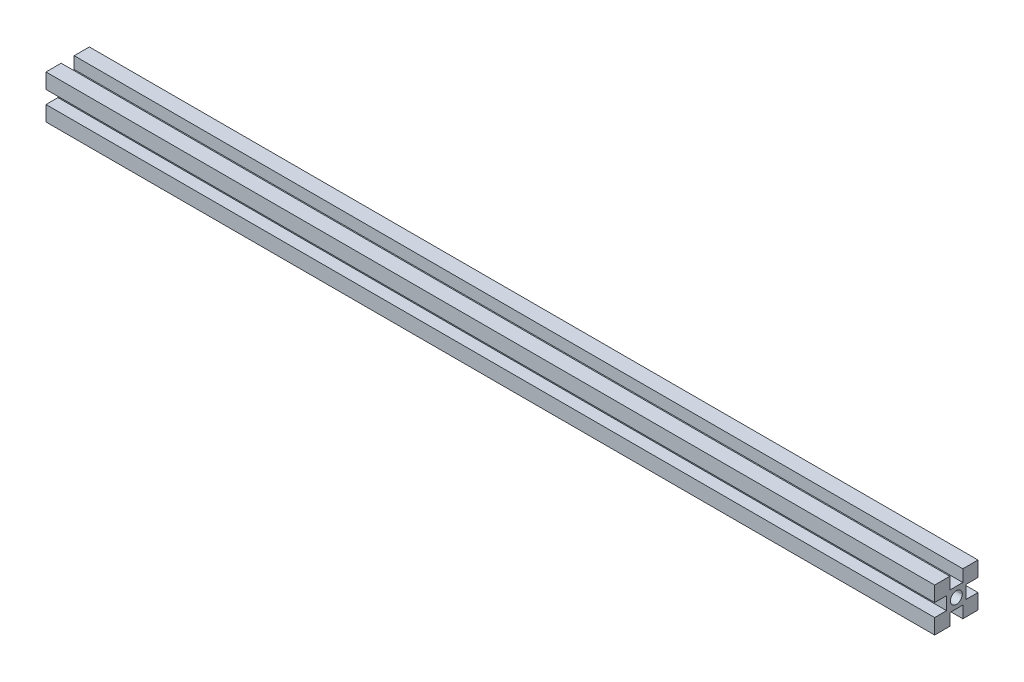
ISO-10303-21;
HEADER;
FILE_DESCRIPTION(('STEP AP214'),'2;1');
FILE_NAME('part.step','',(''),(''),'','','');
FILE_SCHEMA(('AUTOMOTIVE_DESIGN { 1 0 10303 214 1 1 1 1 }'));
ENDSEC;
DATA;
#1=APPLICATION_CONTEXT('core data for automotive mechanical design processes');
#2=APPLICATION_PROTOCOL_DEFINITION('international standard','automotive_design',2000,#1);
#3=PRODUCT_CONTEXT('',#1,'mechanical');
#4=PRODUCT('Part','Part','',(#3));
#5=PRODUCT_RELATED_PRODUCT_CATEGORY('part','',(#4));
#6=PRODUCT_DEFINITION_FORMATION('','',#4);
#7=PRODUCT_DEFINITION_CONTEXT('part definition',#1,'design');
#8=PRODUCT_DEFINITION('design','',#6,#7);
#9=PRODUCT_DEFINITION_SHAPE('','',#8);
#10=(LENGTH_UNIT() NAMED_UNIT(*) SI_UNIT(.MILLI.,.METRE.));
#11=(NAMED_UNIT(*) PLANE_ANGLE_UNIT() SI_UNIT($,.RADIAN.));
#12=(NAMED_UNIT(*) SI_UNIT($,.STERADIAN.) SOLID_ANGLE_UNIT());
#13=UNCERTAINTY_MEASURE_WITH_UNIT(LENGTH_MEASURE(1.E-05),#10,'distance_accuracy_value','');
#14=(GEOMETRIC_REPRESENTATION_CONTEXT(3) GLOBAL_UNCERTAINTY_ASSIGNED_CONTEXT((#13)) GLOBAL_UNIT_ASSIGNED_CONTEXT((#10,
#11,#12)) REPRESENTATION_CONTEXT('',''));
#15=CARTESIAN_POINT('',(0.,0.,0.));
#16=DIRECTION('',(0.,0.,1.));
#17=DIRECTION('',(1.,0.,0.));
#18=AXIS2_PLACEMENT_3D('',#15,#16,#17);
#19=CARTESIAN_POINT('',(207.5,0.,0.));
#20=DIRECTION('',(-1.,0.,0.));
#21=DIRECTION('',(0.,0.,-1.));
#22=AXIS2_PLACEMENT_3D('',#19,#20,#21);
#23=CYLINDRICAL_SURFACE('',#22,2.75);
#24=CARTESIAN_POINT('',(410.,0.,0.));
#25=DIRECTION('',(1.,0.,0.));
#26=DIRECTION('',(0.,0.,-1.));
#27=AXIS2_PLACEMENT_3D('',#24,#25,#26);
#28=CIRCLE('',#27,2.75);
#29=CARTESIAN_POINT('',(410.,0.,2.75));
#30=VERTEX_POINT('',#29);
#31=CARTESIAN_POINT('',(410.,0.,-2.75));
#32=VERTEX_POINT('',#31);
#33=EDGE_CURVE('E57',#30,#32,#28,.F.);
#34=ORIENTED_EDGE('',*,*,#33,.F.);
#35=DIRECTION('',(1.,0.,0.));
#36=VECTOR('',#35,1.);
#37=CARTESIAN_POINT('',(207.5,0.,2.75));
#38=LINE('',#37,#36);
#39=CARTESIAN_POINT('',(0.,0.,2.75));
#40=VERTEX_POINT('',#39);
#41=EDGE_CURVE('E352',#40,#30,#38,.T.);
#42=ORIENTED_EDGE('',*,*,#41,.F.);
#43=CARTESIAN_POINT('',(0.,0.,0.));
#44=DIRECTION('',(1.,0.,0.));
#45=DIRECTION('',(0.,0.,-1.));
#46=AXIS2_PLACEMENT_3D('',#43,#44,#45);
#47=CIRCLE('',#46,2.75);
#48=CARTESIAN_POINT('',(0.,0.,-2.75));
#49=VERTEX_POINT('',#48);
#50=EDGE_CURVE('E256',#49,#40,#47,.T.);
#51=ORIENTED_EDGE('',*,*,#50,.F.);
#52=DIRECTION('',(-1.,0.,0.));
#53=VECTOR('',#52,1.);
#54=CARTESIAN_POINT('',(207.5,0.,-2.75));
#55=LINE('',#54,#53);
#56=EDGE_CURVE('E51',#32,#49,#55,.T.);
#57=ORIENTED_EDGE('',*,*,#56,.F.);
#58=EDGE_LOOP('',(#34,#42,#51,#57));
#59=FACE_BOUND('',#58,.T.);
#60=ADVANCED_FACE('F43',(#59),#23,.F.);
#61=CARTESIAN_POINT('',(207.5,0.,0.));
#62=DIRECTION('',(-1.,0.,0.));
#63=DIRECTION('',(0.,0.,-1.));
#64=AXIS2_PLACEMENT_3D('',#61,#62,#63);
#65=CYLINDRICAL_SURFACE('',#64,2.75);
#66=CARTESIAN_POINT('',(410.,0.,0.));
#67=DIRECTION('',(1.,0.,0.));
#68=DIRECTION('',(0.,0.,-1.));
#69=AXIS2_PLACEMENT_3D('',#66,#67,#68);
#70=CIRCLE('',#69,2.75);
#71=EDGE_CURVE('E428',#32,#30,#70,.F.);
#72=ORIENTED_EDGE('',*,*,#71,.F.);
#73=ORIENTED_EDGE('',*,*,#56,.T.);
#74=CARTESIAN_POINT('',(0.,0.,0.));
#75=DIRECTION('',(1.,0.,0.));
#76=DIRECTION('',(0.,0.,-1.));
#77=AXIS2_PLACEMENT_3D('',#74,#75,#76);
#78=CIRCLE('',#77,2.75);
#79=EDGE_CURVE('E254',#40,#49,#78,.T.);
#80=ORIENTED_EDGE('',*,*,#79,.F.);
#81=ORIENTED_EDGE('',*,*,#41,.T.);
#82=EDGE_LOOP('',(#72,#73,#80,#81));
#83=FACE_BOUND('',#82,.T.);
#84=ADVANCED_FACE('F640',(#83),#65,.F.);
#85=CARTESIAN_POINT('',(0.,3.,-4.5));
#86=DIRECTION('',(0.,0.,-1.));
#87=DIRECTION('',(0.,-1.,0.));
#88=AXIS2_PLACEMENT_3D('',#85,#86,#87);
#89=PLANE('',#88);
#90=DIRECTION('',(1.,0.,0.));
#91=VECTOR('',#90,1.);
#92=CARTESIAN_POINT('',(0.,3.,-4.5));
#93=LINE('',#92,#91);
#94=CARTESIAN_POINT('',(0.,3.,-4.5));
#95=VERTEX_POINT('',#94);
#96=CARTESIAN_POINT('',(410.,3.,-4.5));
#97=VERTEX_POINT('',#96);
#98=EDGE_CURVE('E348',#95,#97,#93,.T.);
#99=ORIENTED_EDGE('',*,*,#98,.T.);
#100=DIRECTION('',(0.,-1.,0.));
#101=VECTOR('',#100,1.);
#102=CARTESIAN_POINT('',(410.,3.,-4.5));
#103=LINE('',#102,#101);
#104=CARTESIAN_POINT('',(410.,-3.,-4.5));
#105=VERTEX_POINT('',#104);
#106=EDGE_CURVE('E65',#97,#105,#103,.T.);
#107=ORIENTED_EDGE('',*,*,#106,.T.);
#108=DIRECTION('',(1.,0.,0.));
#109=VECTOR('',#108,1.);
#110=CARTESIAN_POINT('',(0.,-3.,-4.5));
#111=LINE('',#110,#109);
#112=CARTESIAN_POINT('',(0.,-3.,-4.5));
#113=VERTEX_POINT('',#112);
#114=EDGE_CURVE('E320',#113,#105,#111,.T.);
#115=ORIENTED_EDGE('',*,*,#114,.F.);
#116=DIRECTION('',(0.,-1.,0.));
#117=VECTOR('',#116,1.);
#118=CARTESIAN_POINT('',(0.,3.,-4.5));
#119=LINE('',#118,#117);
#120=EDGE_CURVE('E331',#95,#113,#119,.T.);
#121=ORIENTED_EDGE('',*,*,#120,.F.);
#122=EDGE_LOOP('',(#99,#107,#115,#121));
#123=FACE_BOUND('',#122,.T.);
#124=ADVANCED_FACE('F635',(#123),#89,.T.);
#125=CARTESIAN_POINT('',(0.,-3.,-4.5));
#126=DIRECTION('',(0.,1.,0.));
#127=DIRECTION('',(1.,0.,0.));
#128=AXIS2_PLACEMENT_3D('',#125,#126,#127);
#129=PLANE('',#128);
#130=ORIENTED_EDGE('',*,*,#114,.T.);
#131=DIRECTION('',(0.,0.,-1.));
#132=VECTOR('',#131,1.);
#133=CARTESIAN_POINT('',(410.,-3.,-4.5));
#134=LINE('',#133,#132);
#135=CARTESIAN_POINT('',(410.,-3.,-10.));
#136=VERTEX_POINT('',#135);
#137=EDGE_CURVE('E904',#105,#136,#134,.T.);
#138=ORIENTED_EDGE('',*,*,#137,.T.);
#139=DIRECTION('',(1.,0.,0.));
#140=VECTOR('',#139,1.);
#141=CARTESIAN_POINT('',(0.,-3.,-10.));
#142=LINE('',#141,#140);
#143=CARTESIAN_POINT('',(0.,-3.,-10.));
#144=VERTEX_POINT('',#143);
#145=EDGE_CURVE('E317',#144,#136,#142,.T.);
#146=ORIENTED_EDGE('',*,*,#145,.F.);
#147=DIRECTION('',(0.,0.,-1.));
#148=VECTOR('',#147,1.);
#149=CARTESIAN_POINT('',(0.,-3.,-4.5));
#150=LINE('',#149,#148);
#151=EDGE_CURVE('E330',#113,#144,#150,.T.);
#152=ORIENTED_EDGE('',*,*,#151,.F.);
#153=EDGE_LOOP('',(#130,#138,#146,#152));
#154=FACE_BOUND('',#153,.T.);
#155=ADVANCED_FACE('F827',(#154),#129,.T.);
#156=CARTESIAN_POINT('',(0.,-3.,-10.));
#157=DIRECTION('',(0.,0.,-1.));
#158=DIRECTION('',(0.,-1.,0.));
#159=AXIS2_PLACEMENT_3D('',#156,#157,#158);
#160=PLANE('',#159);
#161=ORIENTED_EDGE('',*,*,#145,.T.);
#162=DIRECTION('',(0.,1.,0.));
#163=VECTOR('',#162,1.);
#164=CARTESIAN_POINT('',(410.,10.,-10.));
#165=LINE('',#164,#163);
#166=CARTESIAN_POINT('',(410.,-10.,-10.));
#167=VERTEX_POINT('',#166);
#168=EDGE_CURVE('E897',#167,#136,#165,.T.);
#169=ORIENTED_EDGE('',*,*,#168,.F.);
#170=DIRECTION('',(1.,0.,0.));
#171=VECTOR('',#170,1.);
#172=CARTESIAN_POINT('',(0.,-10.,-10.));
#173=LINE('',#172,#171);
#174=CARTESIAN_POINT('',(0.,-10.,-10.));
#175=VERTEX_POINT('',#174);
#176=EDGE_CURVE('E321',#175,#167,#173,.T.);
#177=ORIENTED_EDGE('',*,*,#176,.F.);
#178=DIRECTION('',(0.,-1.,0.));
#179=VECTOR('',#178,1.);
#180=CARTESIAN_POINT('',(0.,-3.,-10.));
#181=LINE('',#180,#179);
#182=EDGE_CURVE('E327',#144,#175,#181,.T.);
#183=ORIENTED_EDGE('',*,*,#182,.F.);
#184=EDGE_LOOP('',(#161,#169,#177,#183));
#185=FACE_BOUND('',#184,.T.);
#186=ADVANCED_FACE('F818',(#185),#160,.T.);
#187=CARTESIAN_POINT('',(0.,-10.,-10.));
#188=DIRECTION('',(0.,-1.,0.));
#189=DIRECTION('',(0.,0.,-1.));
#190=AXIS2_PLACEMENT_3D('',#187,#188,#189);
#191=PLANE('',#190);
#192=ORIENTED_EDGE('',*,*,#176,.T.);
#193=DIRECTION('',(0.,0.,-1.));
#194=VECTOR('',#193,1.);
#195=CARTESIAN_POINT('',(410.,-10.,10.));
#196=LINE('',#195,#194);
#197=CARTESIAN_POINT('',(410.,-10.,-3.));
#198=VERTEX_POINT('',#197);
#199=EDGE_CURVE('E234',#198,#167,#196,.T.);
#200=ORIENTED_EDGE('',*,*,#199,.F.);
#201=DIRECTION('',(1.,0.,0.));
#202=VECTOR('',#201,1.);
#203=CARTESIAN_POINT('',(0.,-10.,-3.));
#204=LINE('',#203,#202);
#205=CARTESIAN_POINT('',(0.,-10.,-3.));
#206=VERTEX_POINT('',#205);
#207=EDGE_CURVE('E326',#206,#198,#204,.T.);
#208=ORIENTED_EDGE('',*,*,#207,.F.);
#209=DIRECTION('',(0.,0.,1.));
#210=VECTOR('',#209,1.);
#211=CARTESIAN_POINT('',(0.,-10.,-10.));
#212=LINE('',#211,#210);
#213=EDGE_CURVE('E268',#175,#206,#212,.T.);
#214=ORIENTED_EDGE('',*,*,#213,.F.);
#215=EDGE_LOOP('',(#192,#200,#208,#214));
#216=FACE_BOUND('',#215,.T.);
#217=ADVANCED_FACE('F452',(#216),#191,.T.);
#218=CARTESIAN_POINT('',(0.,-10.,-3.));
#219=DIRECTION('',(0.,0.,1.));
#220=DIRECTION('',(1.,0.,0.));
#221=AXIS2_PLACEMENT_3D('',#218,#219,#220);
#222=PLANE('',#221);
#223=ORIENTED_EDGE('',*,*,#207,.T.);
#224=DIRECTION('',(0.,1.,0.));
#225=VECTOR('',#224,1.);
#226=CARTESIAN_POINT('',(410.,-10.,-3.));
#227=LINE('',#226,#225);
#228=CARTESIAN_POINT('',(410.,-4.5,-3.));
#229=VERTEX_POINT('',#228);
#230=EDGE_CURVE('E425',#198,#229,#227,.T.);
#231=ORIENTED_EDGE('',*,*,#230,.T.);
#232=DIRECTION('',(1.,0.,0.));
#233=VECTOR('',#232,1.);
#234=CARTESIAN_POINT('',(0.,-4.5,-3.));
#235=LINE('',#234,#233);
#236=CARTESIAN_POINT('',(0.,-4.5,-3.));
#237=VERTEX_POINT('',#236);
#238=EDGE_CURVE('E322',#237,#229,#235,.T.);
#239=ORIENTED_EDGE('',*,*,#238,.F.);
#240=DIRECTION('',(0.,1.,0.));
#241=VECTOR('',#240,1.);
#242=CARTESIAN_POINT('',(0.,-10.,-3.));
#243=LINE('',#242,#241);
#244=EDGE_CURVE('E259',#206,#237,#243,.T.);
#245=ORIENTED_EDGE('',*,*,#244,.F.);
#246=EDGE_LOOP('',(#223,#231,#239,#245));
#247=FACE_BOUND('',#246,.T.);
#248=ADVANCED_FACE('F454',(#247),#222,.T.);
#249=CARTESIAN_POINT('',(0.,-4.5,-3.));
#250=DIRECTION('',(0.,-1.,0.));
#251=DIRECTION('',(0.,0.,-1.));
#252=AXIS2_PLACEMENT_3D('',#249,#250,#251);
#253=PLANE('',#252);
#254=ORIENTED_EDGE('',*,*,#238,.T.);
#255=DIRECTION('',(0.,0.,1.));
#256=VECTOR('',#255,1.);
#257=CARTESIAN_POINT('',(410.,-4.5,-3.));
#258=LINE('',#257,#256);
#259=CARTESIAN_POINT('',(410.,-4.5,3.));
#260=VERTEX_POINT('',#259);
#261=EDGE_CURVE('E417',#229,#260,#258,.T.);
#262=ORIENTED_EDGE('',*,*,#261,.T.);
#263=DIRECTION('',(1.,0.,0.));
#264=VECTOR('',#263,1.);
#265=CARTESIAN_POINT('',(0.,-4.5,3.));
#266=LINE('',#265,#264);
#267=CARTESIAN_POINT('',(0.,-4.5,3.));
#268=VERTEX_POINT('',#267);
#269=EDGE_CURVE('E246',#268,#260,#266,.T.);
#270=ORIENTED_EDGE('',*,*,#269,.F.);
#271=DIRECTION('',(0.,0.,1.));
#272=VECTOR('',#271,1.);
#273=CARTESIAN_POINT('',(0.,-4.5,-3.));
#274=LINE('',#273,#272);
#275=EDGE_CURVE('E257',#237,#268,#274,.T.);
#276=ORIENTED_EDGE('',*,*,#275,.F.);
#277=EDGE_LOOP('',(#254,#262,#270,#276));
#278=FACE_BOUND('',#277,.T.);
#279=ADVANCED_FACE('F456',(#278),#253,.T.);
#280=CARTESIAN_POINT('',(0.,-4.5,3.));
#281=DIRECTION('',(0.,0.,-1.));
#282=DIRECTION('',(0.,-1.,0.));
#283=AXIS2_PLACEMENT_3D('',#280,#281,#282);
#284=PLANE('',#283);
#285=ORIENTED_EDGE('',*,*,#269,.T.);
#286=DIRECTION('',(0.,-1.,0.));
#287=VECTOR('',#286,1.);
#288=CARTESIAN_POINT('',(410.,-4.5,3.));
#289=LINE('',#288,#287);
#290=CARTESIAN_POINT('',(410.,-10.,3.));
#291=VERTEX_POINT('',#290);
#292=EDGE_CURVE('E415',#260,#291,#289,.T.);
#293=ORIENTED_EDGE('',*,*,#292,.T.);
#294=DIRECTION('',(1.,0.,0.));
#295=VECTOR('',#294,1.);
#296=CARTESIAN_POINT('',(0.,-10.,3.));
#297=LINE('',#296,#295);
#298=CARTESIAN_POINT('',(0.,-10.,3.));
#299=VERTEX_POINT('',#298);
#300=EDGE_CURVE('E232',#299,#291,#297,.T.);
#301=ORIENTED_EDGE('',*,*,#300,.F.);
#302=DIRECTION('',(0.,-1.,0.));
#303=VECTOR('',#302,1.);
#304=CARTESIAN_POINT('',(0.,-4.5,3.));
#305=LINE('',#304,#303);
#306=EDGE_CURVE('E260',#268,#299,#305,.T.);
#307=ORIENTED_EDGE('',*,*,#306,.F.);
#308=EDGE_LOOP('',(#285,#293,#301,#307));
#309=FACE_BOUND('',#308,.T.);
#310=ADVANCED_FACE('F458',(#309),#284,.T.);
#311=CARTESIAN_POINT('',(0.,-10.,3.));
#312=DIRECTION('',(0.,-1.,0.));
#313=DIRECTION('',(0.,0.,-1.));
#314=AXIS2_PLACEMENT_3D('',#311,#312,#313);
#315=PLANE('',#314);
#316=ORIENTED_EDGE('',*,*,#300,.T.);
#317=CARTESIAN_POINT('',(410.,-10.,10.));
#318=VERTEX_POINT('',#317);
#319=EDGE_CURVE('E214',#318,#291,#196,.T.);
#320=ORIENTED_EDGE('',*,*,#319,.F.);
#321=DIRECTION('',(1.,0.,0.));
#322=VECTOR('',#321,1.);
#323=CARTESIAN_POINT('',(0.,-10.,10.));
#324=LINE('',#323,#322);
#325=CARTESIAN_POINT('',(0.,-10.,10.));
#326=VERTEX_POINT('',#325);
#327=EDGE_CURVE('E229',#326,#318,#324,.T.);
#328=ORIENTED_EDGE('',*,*,#327,.F.);
#329=DIRECTION('',(0.,0.,1.));
#330=VECTOR('',#329,1.);
#331=CARTESIAN_POINT('',(0.,-10.,3.));
#332=LINE('',#331,#330);
#333=EDGE_CURVE('E271',#299,#326,#332,.T.);
#334=ORIENTED_EDGE('',*,*,#333,.F.);
#335=EDGE_LOOP('',(#316,#320,#328,#334));
#336=FACE_BOUND('',#335,.T.);
#337=ADVANCED_FACE('F227',(#336),#315,.T.);
#338=CARTESIAN_POINT('',(0.,-10.,10.));
#339=DIRECTION('',(0.,0.,1.));
#340=DIRECTION('',(1.,0.,0.));
#341=AXIS2_PLACEMENT_3D('',#338,#339,#340);
#342=PLANE('',#341);
#343=ORIENTED_EDGE('',*,*,#327,.T.);
#344=DIRECTION('',(0.,-1.,0.));
#345=VECTOR('',#344,1.);
#346=CARTESIAN_POINT('',(410.,10.,10.));
#347=LINE('',#346,#345);
#348=CARTESIAN_POINT('',(410.,-3.,10.));
#349=VERTEX_POINT('',#348);
#350=EDGE_CURVE('E211',#349,#318,#347,.T.);
#351=ORIENTED_EDGE('',*,*,#350,.F.);
#352=DIRECTION('',(1.,0.,0.));
#353=VECTOR('',#352,1.);
#354=CARTESIAN_POINT('',(0.,-3.,10.));
#355=LINE('',#354,#353);
#356=CARTESIAN_POINT('',(0.,-3.,10.));
#357=VERTEX_POINT('',#356);
#358=EDGE_CURVE('E239',#357,#349,#355,.T.);
#359=ORIENTED_EDGE('',*,*,#358,.F.);
#360=DIRECTION('',(0.,1.,0.));
#361=VECTOR('',#360,1.);
#362=CARTESIAN_POINT('',(0.,-10.,10.));
#363=LINE('',#362,#361);
#364=EDGE_CURVE('E237',#326,#357,#363,.T.);
#365=ORIENTED_EDGE('',*,*,#364,.F.);
#366=EDGE_LOOP('',(#343,#351,#359,#365));
#367=FACE_BOUND('',#366,.T.);
#368=ADVANCED_FACE('F236',(#367),#342,.T.);
#369=CARTESIAN_POINT('',(0.,-3.,10.));
#370=DIRECTION('',(0.,1.,0.));
#371=DIRECTION('',(1.,0.,0.));
#372=AXIS2_PLACEMENT_3D('',#369,#370,#371);
#373=PLANE('',#372);
#374=ORIENTED_EDGE('',*,*,#358,.T.);
#375=DIRECTION('',(0.,0.,-1.));
#376=VECTOR('',#375,1.);
#377=CARTESIAN_POINT('',(410.,-3.,10.));
#378=LINE('',#377,#376);
#379=CARTESIAN_POINT('',(410.,-3.,4.5));
#380=VERTEX_POINT('',#379);
#381=EDGE_CURVE('E217',#349,#380,#378,.T.);
#382=ORIENTED_EDGE('',*,*,#381,.T.);
#383=DIRECTION('',(1.,0.,0.));
#384=VECTOR('',#383,1.);
#385=CARTESIAN_POINT('',(0.,-3.,4.5));
#386=LINE('',#385,#384);
#387=CARTESIAN_POINT('',(0.,-3.,4.5));
#388=VERTEX_POINT('',#387);
#389=EDGE_CURVE('E249',#388,#380,#386,.T.);
#390=ORIENTED_EDGE('',*,*,#389,.F.);
#391=DIRECTION('',(0.,0.,-1.));
#392=VECTOR('',#391,1.);
#393=CARTESIAN_POINT('',(0.,-3.,10.));
#394=LINE('',#393,#392);
#395=EDGE_CURVE('E347',#357,#388,#394,.T.);
#396=ORIENTED_EDGE('',*,*,#395,.F.);
#397=EDGE_LOOP('',(#374,#382,#390,#396));
#398=FACE_BOUND('',#397,.T.);
#399=ADVANCED_FACE('F414',(#398),#373,.T.);
#400=CARTESIAN_POINT('',(0.,-3.,4.5));
#401=DIRECTION('',(0.,0.,1.));
#402=DIRECTION('',(1.,0.,0.));
#403=AXIS2_PLACEMENT_3D('',#400,#401,#402);
#404=PLANE('',#403);
#405=ORIENTED_EDGE('',*,*,#389,.T.);
#406=DIRECTION('',(0.,1.,0.));
#407=VECTOR('',#406,1.);
#408=CARTESIAN_POINT('',(410.,-3.,4.5));
#409=LINE('',#408,#407);
#410=CARTESIAN_POINT('',(410.,3.,4.5));
#411=VERTEX_POINT('',#410);
#412=EDGE_CURVE('E411',#380,#411,#409,.T.);
#413=ORIENTED_EDGE('',*,*,#412,.T.);
#414=DIRECTION('',(1.,0.,0.));
#415=VECTOR('',#414,1.);
#416=CARTESIAN_POINT('',(0.,3.,4.5));
#417=LINE('',#416,#415);
#418=CARTESIAN_POINT('',(0.,3.,4.5));
#419=VERTEX_POINT('',#418);
#420=EDGE_CURVE('E303',#419,#411,#417,.T.);
#421=ORIENTED_EDGE('',*,*,#420,.F.);
#422=DIRECTION('',(0.,1.,0.));
#423=VECTOR('',#422,1.);
#424=CARTESIAN_POINT('',(0.,-3.,4.5));
#425=LINE('',#424,#423);
#426=EDGE_CURVE('E361',#388,#419,#425,.T.);
#427=ORIENTED_EDGE('',*,*,#426,.F.);
#428=EDGE_LOOP('',(#405,#413,#421,#427));
#429=FACE_BOUND('',#428,.T.);
#430=ADVANCED_FACE('F409',(#429),#404,.T.);
#431=CARTESIAN_POINT('',(0.,3.,4.5));
#432=DIRECTION('',(0.,-1.,0.));
#433=DIRECTION('',(0.,0.,-1.));
#434=AXIS2_PLACEMENT_3D('',#431,#432,#433);
#435=PLANE('',#434);
#436=ORIENTED_EDGE('',*,*,#420,.T.);
#437=DIRECTION('',(0.,0.,1.));
#438=VECTOR('',#437,1.);
#439=CARTESIAN_POINT('',(410.,3.,4.5));
#440=LINE('',#439,#438);
#441=CARTESIAN_POINT('',(410.,3.,10.));
#442=VERTEX_POINT('',#441);
#443=EDGE_CURVE('E419',#411,#442,#440,.T.);
#444=ORIENTED_EDGE('',*,*,#443,.T.);
#445=DIRECTION('',(1.,0.,0.));
#446=VECTOR('',#445,1.);
#447=CARTESIAN_POINT('',(0.,3.,10.));
#448=LINE('',#447,#446);
#449=CARTESIAN_POINT('',(0.,3.,10.));
#450=VERTEX_POINT('',#449);
#451=EDGE_CURVE('E294',#450,#442,#448,.T.);
#452=ORIENTED_EDGE('',*,*,#451,.F.);
#453=DIRECTION('',(0.,0.,1.));
#454=VECTOR('',#453,1.);
#455=CARTESIAN_POINT('',(0.,3.,4.5));
#456=LINE('',#455,#454);
#457=EDGE_CURVE('E364',#419,#450,#456,.T.);
#458=ORIENTED_EDGE('',*,*,#457,.F.);
#459=EDGE_LOOP('',(#436,#444,#452,#458));
#460=FACE_BOUND('',#459,.T.);
#461=ADVANCED_FACE('F462',(#460),#435,.T.);
#462=CARTESIAN_POINT('',(0.,3.,10.));
#463=DIRECTION('',(0.,0.,1.));
#464=DIRECTION('',(1.,0.,0.));
#465=AXIS2_PLACEMENT_3D('',#462,#463,#464);
#466=PLANE('',#465);
#467=ORIENTED_EDGE('',*,*,#451,.T.);
#468=CARTESIAN_POINT('',(410.,10.,10.));
#469=VERTEX_POINT('',#468);
#470=EDGE_CURVE('E222',#469,#442,#347,.T.);
#471=ORIENTED_EDGE('',*,*,#470,.F.);
#472=DIRECTION('',(1.,0.,0.));
#473=VECTOR('',#472,1.);
#474=CARTESIAN_POINT('',(0.,10.,10.));
#475=LINE('',#474,#473);
#476=CARTESIAN_POINT('',(0.,10.,10.));
#477=VERTEX_POINT('',#476);
#478=EDGE_CURVE('E287',#477,#469,#475,.T.);
#479=ORIENTED_EDGE('',*,*,#478,.F.);
#480=DIRECTION('',(0.,1.,0.));
#481=VECTOR('',#480,1.);
#482=CARTESIAN_POINT('',(0.,3.,10.));
#483=LINE('',#482,#481);
#484=EDGE_CURVE('E382',#450,#477,#483,.T.);
#485=ORIENTED_EDGE('',*,*,#484,.F.);
#486=EDGE_LOOP('',(#467,#471,#479,#485));
#487=FACE_BOUND('',#486,.T.);
#488=ADVANCED_FACE('F463',(#487),#466,.T.);
#489=CARTESIAN_POINT('',(0.,10.,10.));
#490=DIRECTION('',(0.,1.,0.));
#491=DIRECTION('',(1.,0.,0.));
#492=AXIS2_PLACEMENT_3D('',#489,#490,#491);
#493=PLANE('',#492);
#494=ORIENTED_EDGE('',*,*,#478,.T.);
#495=DIRECTION('',(0.,0.,1.));
#496=VECTOR('',#495,1.);
#497=CARTESIAN_POINT('',(410.,10.,10.));
#498=LINE('',#497,#496);
#499=CARTESIAN_POINT('',(410.,10.,3.));
#500=VERTEX_POINT('',#499);
#501=EDGE_CURVE('E899',#500,#469,#498,.T.);
#502=ORIENTED_EDGE('',*,*,#501,.F.);
#503=DIRECTION('',(1.,0.,0.));
#504=VECTOR('',#503,1.);
#505=CARTESIAN_POINT('',(0.,10.,3.));
#506=LINE('',#505,#504);
#507=CARTESIAN_POINT('',(0.,10.,3.));
#508=VERTEX_POINT('',#507);
#509=EDGE_CURVE('E284',#508,#500,#506,.T.);
#510=ORIENTED_EDGE('',*,*,#509,.F.);
#511=DIRECTION('',(0.,0.,-1.));
#512=VECTOR('',#511,1.);
#513=CARTESIAN_POINT('',(0.,10.,10.));
#514=LINE('',#513,#512);
#515=EDGE_CURVE('E366',#477,#508,#514,.T.);
#516=ORIENTED_EDGE('',*,*,#515,.F.);
#517=EDGE_LOOP('',(#494,#502,#510,#516));
#518=FACE_BOUND('',#517,.T.);
#519=ADVANCED_FACE('F728',(#518),#493,.T.);
#520=CARTESIAN_POINT('',(0.,10.,3.));
#521=DIRECTION('',(0.,0.,-1.));
#522=DIRECTION('',(0.,-1.,0.));
#523=AXIS2_PLACEMENT_3D('',#520,#521,#522);
#524=PLANE('',#523);
#525=ORIENTED_EDGE('',*,*,#509,.T.);
#526=DIRECTION('',(0.,-1.,0.));
#527=VECTOR('',#526,1.);
#528=CARTESIAN_POINT('',(410.,10.,3.));
#529=LINE('',#528,#527);
#530=CARTESIAN_POINT('',(410.,4.5,3.));
#531=VERTEX_POINT('',#530);
#532=EDGE_CURVE('E913',#500,#531,#529,.T.);
#533=ORIENTED_EDGE('',*,*,#532,.T.);
#534=DIRECTION('',(1.,0.,0.));
#535=VECTOR('',#534,1.);
#536=CARTESIAN_POINT('',(0.,4.5,3.));
#537=LINE('',#536,#535);
#538=CARTESIAN_POINT('',(0.,4.5,3.));
#539=VERTEX_POINT('',#538);
#540=EDGE_CURVE('E288',#539,#531,#537,.T.);
#541=ORIENTED_EDGE('',*,*,#540,.F.);
#542=DIRECTION('',(0.,-1.,0.));
#543=VECTOR('',#542,1.);
#544=CARTESIAN_POINT('',(0.,10.,3.));
#545=LINE('',#544,#543);
#546=EDGE_CURVE('E291',#508,#539,#545,.T.);
#547=ORIENTED_EDGE('',*,*,#546,.F.);
#548=EDGE_LOOP('',(#525,#533,#541,#547));
#549=FACE_BOUND('',#548,.T.);
#550=ADVANCED_FACE('F718',(#549),#524,.T.);
#551=CARTESIAN_POINT('',(0.,4.5,3.));
#552=DIRECTION('',(0.,1.,0.));
#553=DIRECTION('',(1.,0.,0.));
#554=AXIS2_PLACEMENT_3D('',#551,#552,#553);
#555=PLANE('',#554);
#556=ORIENTED_EDGE('',*,*,#540,.T.);
#557=DIRECTION('',(0.,0.,-1.));
#558=VECTOR('',#557,1.);
#559=CARTESIAN_POINT('',(410.,4.5,3.));
#560=LINE('',#559,#558);
#561=CARTESIAN_POINT('',(410.,4.5,-3.));
#562=VERTEX_POINT('',#561);
#563=EDGE_CURVE('E910',#531,#562,#560,.T.);
#564=ORIENTED_EDGE('',*,*,#563,.T.);
#565=DIRECTION('',(1.,0.,0.));
#566=VECTOR('',#565,1.);
#567=CARTESIAN_POINT('',(0.,4.5,-3.));
#568=LINE('',#567,#566);
#569=CARTESIAN_POINT('',(0.,4.5,-3.));
#570=VERTEX_POINT('',#569);
#571=EDGE_CURVE('E344',#570,#562,#568,.T.);
#572=ORIENTED_EDGE('',*,*,#571,.F.);
#573=DIRECTION('',(0.,0.,-1.));
#574=VECTOR('',#573,1.);
#575=CARTESIAN_POINT('',(0.,4.5,3.));
#576=LINE('',#575,#574);
#577=EDGE_CURVE('E289',#539,#570,#576,.T.);
#578=ORIENTED_EDGE('',*,*,#577,.F.);
#579=EDGE_LOOP('',(#556,#564,#572,#578));
#580=FACE_BOUND('',#579,.T.);
#581=ADVANCED_FACE('F708',(#580),#555,.T.);
#582=CARTESIAN_POINT('',(0.,4.5,-3.));
#583=DIRECTION('',(0.,0.,1.));
#584=DIRECTION('',(1.,0.,0.));
#585=AXIS2_PLACEMENT_3D('',#582,#583,#584);
#586=PLANE('',#585);
#587=ORIENTED_EDGE('',*,*,#571,.T.);
#588=DIRECTION('',(0.,1.,0.));
#589=VECTOR('',#588,1.);
#590=CARTESIAN_POINT('',(410.,4.5,-3.));
#591=LINE('',#590,#589);
#592=CARTESIAN_POINT('',(410.,10.,-3.));
#593=VERTEX_POINT('',#592);
#594=EDGE_CURVE('E907',#562,#593,#591,.T.);
#595=ORIENTED_EDGE('',*,*,#594,.T.);
#596=DIRECTION('',(1.,0.,0.));
#597=VECTOR('',#596,1.);
#598=CARTESIAN_POINT('',(0.,10.,-3.));
#599=LINE('',#598,#597);
#600=CARTESIAN_POINT('',(0.,10.,-3.));
#601=VERTEX_POINT('',#600);
#602=EDGE_CURVE('E353',#601,#593,#599,.T.);
#603=ORIENTED_EDGE('',*,*,#602,.F.);
#604=DIRECTION('',(0.,1.,0.));
#605=VECTOR('',#604,1.);
#606=CARTESIAN_POINT('',(0.,4.5,-3.));
#607=LINE('',#606,#605);
#608=EDGE_CURVE('E292',#570,#601,#607,.T.);
#609=ORIENTED_EDGE('',*,*,#608,.F.);
#610=EDGE_LOOP('',(#587,#595,#603,#609));
#611=FACE_BOUND('',#610,.T.);
#612=ADVANCED_FACE('F698',(#611),#586,.T.);
#613=CARTESIAN_POINT('',(0.,10.,-3.));
#614=DIRECTION('',(0.,1.,0.));
#615=DIRECTION('',(1.,0.,0.));
#616=AXIS2_PLACEMENT_3D('',#613,#614,#615);
#617=PLANE('',#616);
#618=ORIENTED_EDGE('',*,*,#602,.T.);
#619=CARTESIAN_POINT('',(410.,10.,-10.));
#620=VERTEX_POINT('',#619);
#621=EDGE_CURVE('E901',#620,#593,#498,.T.);
#622=ORIENTED_EDGE('',*,*,#621,.F.);
#623=DIRECTION('',(1.,0.,0.));
#624=VECTOR('',#623,1.);
#625=CARTESIAN_POINT('',(0.,10.,-10.));
#626=LINE('',#625,#624);
#627=CARTESIAN_POINT('',(0.,10.,-10.));
#628=VERTEX_POINT('',#627);
#629=EDGE_CURVE('E357',#628,#620,#626,.T.);
#630=ORIENTED_EDGE('',*,*,#629,.F.);
#631=DIRECTION('',(0.,0.,-1.));
#632=VECTOR('',#631,1.);
#633=CARTESIAN_POINT('',(0.,10.,-3.));
#634=LINE('',#633,#632);
#635=EDGE_CURVE('E340',#601,#628,#634,.T.);
#636=ORIENTED_EDGE('',*,*,#635,.F.);
#637=EDGE_LOOP('',(#618,#622,#630,#636));
#638=FACE_BOUND('',#637,.T.);
#639=ADVANCED_FACE('F689',(#638),#617,.T.);
#640=CARTESIAN_POINT('',(0.,10.,-10.));
#641=DIRECTION('',(0.,0.,-1.));
#642=DIRECTION('',(0.,-1.,0.));
#643=AXIS2_PLACEMENT_3D('',#640,#641,#642);
#644=PLANE('',#643);
#645=ORIENTED_EDGE('',*,*,#629,.T.);
#646=CARTESIAN_POINT('',(410.,3.,-10.));
#647=VERTEX_POINT('',#646);
#648=EDGE_CURVE('E233',#647,#620,#165,.T.);
#649=ORIENTED_EDGE('',*,*,#648,.F.);
#650=DIRECTION('',(1.,0.,0.));
#651=VECTOR('',#650,1.);
#652=CARTESIAN_POINT('',(0.,3.,-10.));
#653=LINE('',#652,#651);
#654=CARTESIAN_POINT('',(0.,3.,-10.));
#655=VERTEX_POINT('',#654);
#656=EDGE_CURVE('E282',#655,#647,#653,.T.);
#657=ORIENTED_EDGE('',*,*,#656,.F.);
#658=DIRECTION('',(0.,-1.,0.));
#659=VECTOR('',#658,1.);
#660=CARTESIAN_POINT('',(0.,10.,-10.));
#661=LINE('',#660,#659);
#662=EDGE_CURVE('E337',#628,#655,#661,.T.);
#663=ORIENTED_EDGE('',*,*,#662,.F.);
#664=EDGE_LOOP('',(#645,#649,#657,#663));
#665=FACE_BOUND('',#664,.T.);
#666=ADVANCED_FACE('F678',(#665),#644,.T.);
#667=CARTESIAN_POINT('',(0.,3.,-10.));
#668=DIRECTION('',(0.,-1.,0.));
#669=DIRECTION('',(0.,0.,-1.));
#670=AXIS2_PLACEMENT_3D('',#667,#668,#669);
#671=PLANE('',#670);
#672=ORIENTED_EDGE('',*,*,#656,.T.);
#673=DIRECTION('',(0.,0.,1.));
#674=VECTOR('',#673,1.);
#675=CARTESIAN_POINT('',(410.,3.,-10.));
#676=LINE('',#675,#674);
#677=EDGE_CURVE('E11',#647,#97,#676,.T.);
#678=ORIENTED_EDGE('',*,*,#677,.T.);
#679=ORIENTED_EDGE('',*,*,#98,.F.);
#680=DIRECTION('',(0.,0.,1.));
#681=VECTOR('',#680,1.);
#682=CARTESIAN_POINT('',(0.,3.,-10.));
#683=LINE('',#682,#681);
#684=EDGE_CURVE('E334',#655,#95,#683,.T.);
#685=ORIENTED_EDGE('',*,*,#684,.F.);
#686=EDGE_LOOP('',(#672,#678,#679,#685));
#687=FACE_BOUND('',#686,.T.);
#688=ADVANCED_FACE('F666',(#687),#671,.T.);
#689=CARTESIAN_POINT('',(0.,0.,0.));
#690=DIRECTION('',(1.,0.,0.));
#691=DIRECTION('',(0.,1.,0.));
#692=AXIS2_PLACEMENT_3D('',#689,#690,#691);
#693=PLANE('',#692);
#694=ORIENTED_EDGE('',*,*,#684,.T.);
#695=ORIENTED_EDGE('',*,*,#120,.T.);
#696=ORIENTED_EDGE('',*,*,#151,.T.);
#697=ORIENTED_EDGE('',*,*,#182,.T.);
#698=ORIENTED_EDGE('',*,*,#213,.T.);
#699=ORIENTED_EDGE('',*,*,#244,.T.);
#700=ORIENTED_EDGE('',*,*,#275,.T.);
#701=ORIENTED_EDGE('',*,*,#306,.T.);
#702=ORIENTED_EDGE('',*,*,#333,.T.);
#703=ORIENTED_EDGE('',*,*,#364,.T.);
#704=ORIENTED_EDGE('',*,*,#395,.T.);
#705=ORIENTED_EDGE('',*,*,#426,.T.);
#706=ORIENTED_EDGE('',*,*,#457,.T.);
#707=ORIENTED_EDGE('',*,*,#484,.T.);
#708=ORIENTED_EDGE('',*,*,#515,.T.);
#709=ORIENTED_EDGE('',*,*,#546,.T.);
#710=ORIENTED_EDGE('',*,*,#577,.T.);
#711=ORIENTED_EDGE('',*,*,#608,.T.);
#712=ORIENTED_EDGE('',*,*,#635,.T.);
#713=ORIENTED_EDGE('',*,*,#662,.T.);
#714=EDGE_LOOP('',(#694,#695,#696,#697,#698,#699,#700,#701,#702,#703,#704,#705,#706,#707,#708,
#709,#710,#711,#712,#713));
#715=FACE_BOUND('',#714,.T.);
#716=ORIENTED_EDGE('',*,*,#50,.T.);
#717=ORIENTED_EDGE('',*,*,#79,.T.);
#718=EDGE_LOOP('',(#716,#717));
#719=FACE_BOUND('',#718,.T.);
#720=ADVANCED_FACE('F45',(#715,#719),#693,.F.);
#721=CARTESIAN_POINT('',(410.,0.,0.));
#722=DIRECTION('',(1.,0.,0.));
#723=DIRECTION('',(0.,0.,-1.));
#724=AXIS2_PLACEMENT_3D('',#721,#722,#723);
#725=PLANE('',#724);
#726=ORIENTED_EDGE('',*,*,#199,.T.);
#727=ORIENTED_EDGE('',*,*,#168,.T.);
#728=ORIENTED_EDGE('',*,*,#137,.F.);
#729=ORIENTED_EDGE('',*,*,#106,.F.);
#730=ORIENTED_EDGE('',*,*,#677,.F.);
#731=ORIENTED_EDGE('',*,*,#648,.T.);
#732=ORIENTED_EDGE('',*,*,#621,.T.);
#733=ORIENTED_EDGE('',*,*,#594,.F.);
#734=ORIENTED_EDGE('',*,*,#563,.F.);
#735=ORIENTED_EDGE('',*,*,#532,.F.);
#736=ORIENTED_EDGE('',*,*,#501,.T.);
#737=ORIENTED_EDGE('',*,*,#470,.T.);
#738=ORIENTED_EDGE('',*,*,#443,.F.);
#739=ORIENTED_EDGE('',*,*,#412,.F.);
#740=ORIENTED_EDGE('',*,*,#381,.F.);
#741=ORIENTED_EDGE('',*,*,#350,.T.);
#742=ORIENTED_EDGE('',*,*,#319,.T.);
#743=ORIENTED_EDGE('',*,*,#292,.F.);
#744=ORIENTED_EDGE('',*,*,#261,.F.);
#745=ORIENTED_EDGE('',*,*,#230,.F.);
#746=EDGE_LOOP('',(#726,#727,#728,#729,#730,#731,#732,#733,#734,#735,#736,#737,#738,#739,#740,
#741,#742,#743,#744,#745));
#747=FACE_BOUND('',#746,.T.);
#748=ORIENTED_EDGE('',*,*,#33,.T.);
#749=ORIENTED_EDGE('',*,*,#71,.T.);
#750=EDGE_LOOP('',(#748,#749));
#751=FACE_BOUND('',#750,.T.);
#752=ADVANCED_FACE('F213',(#747,#751),#725,.T.);
#753=CLOSED_SHELL('',(#60,#84,#124,#155,#186,#217,#248,#279,#310,#337,#368,#399,#430,#461,#488,
#519,#550,#581,#612,#639,#666,#688,#720,#752));
#754=MANIFOLD_SOLID_BREP('B2',#753);
#755=ADVANCED_BREP_SHAPE_REPRESENTATION('',(#18,#754),#14);
#756=SHAPE_DEFINITION_REPRESENTATION(#9,#755);
ENDSEC;
END-ISO-10303-21;
